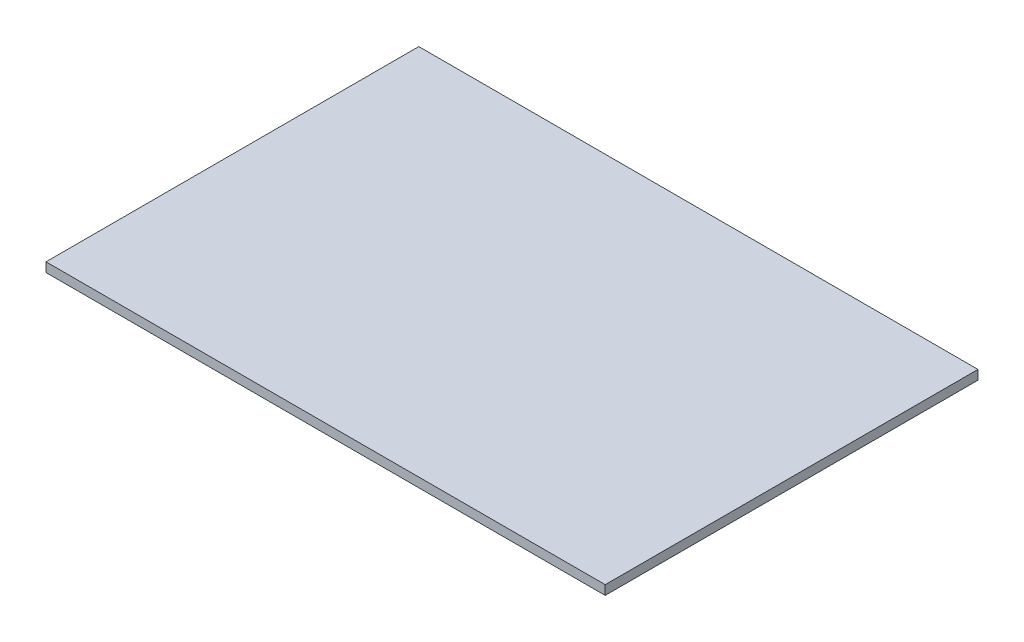
ISO-10303-21;
HEADER;
FILE_DESCRIPTION(('STEP AP214'),'2;1');
FILE_NAME('part.step','',(''),(''),'','','');
FILE_SCHEMA(('AUTOMOTIVE_DESIGN { 1 0 10303 214 1 1 1 1 }'));
ENDSEC;
DATA;
#1=APPLICATION_CONTEXT('core data for automotive mechanical design processes');
#2=APPLICATION_PROTOCOL_DEFINITION('international standard','automotive_design',2000,#1);
#3=PRODUCT_CONTEXT('',#1,'mechanical');
#4=PRODUCT('Part','Part','',(#3));
#5=PRODUCT_RELATED_PRODUCT_CATEGORY('part','',(#4));
#6=PRODUCT_DEFINITION_FORMATION('','',#4);
#7=PRODUCT_DEFINITION_CONTEXT('part definition',#1,'design');
#8=PRODUCT_DEFINITION('design','',#6,#7);
#9=PRODUCT_DEFINITION_SHAPE('','',#8);
#10=(LENGTH_UNIT() NAMED_UNIT(*) SI_UNIT(.MILLI.,.METRE.));
#11=(NAMED_UNIT(*) PLANE_ANGLE_UNIT() SI_UNIT($,.RADIAN.));
#12=(NAMED_UNIT(*) SI_UNIT($,.STERADIAN.) SOLID_ANGLE_UNIT());
#13=UNCERTAINTY_MEASURE_WITH_UNIT(LENGTH_MEASURE(1.E-05),#10,'distance_accuracy_value','');
#14=(GEOMETRIC_REPRESENTATION_CONTEXT(3) GLOBAL_UNCERTAINTY_ASSIGNED_CONTEXT((#13)) GLOBAL_UNIT_ASSIGNED_CONTEXT((#10,
#11,#12)) REPRESENTATION_CONTEXT('',''));
#15=CARTESIAN_POINT('',(0.,0.,0.));
#16=DIRECTION('',(0.,0.,1.));
#17=DIRECTION('',(1.,0.,0.));
#18=AXIS2_PLACEMENT_3D('',#15,#16,#17);
#19=CARTESIAN_POINT('',(-1500.,50.,-1000.));
#20=DIRECTION('',(1.,0.,0.));
#21=DIRECTION('',(0.,0.,-1.));
#22=AXIS2_PLACEMENT_3D('',#19,#20,#21);
#23=PLANE('',#22);
#24=DIRECTION('',(0.,0.,1.));
#25=VECTOR('',#24,1.);
#26=CARTESIAN_POINT('',(-1500.,0.,-1000.));
#27=LINE('',#26,#25);
#28=CARTESIAN_POINT('',(-1500.,0.,-1000.));
#29=VERTEX_POINT('',#28);
#30=CARTESIAN_POINT('',(-1500.,0.,1000.));
#31=VERTEX_POINT('',#30);
#32=EDGE_CURVE('E95',#29,#31,#27,.T.);
#33=ORIENTED_EDGE('',*,*,#32,.T.);
#34=DIRECTION('',(0.,-1.,0.));
#35=VECTOR('',#34,1.);
#36=CARTESIAN_POINT('',(-1500.,50.,1000.));
#37=LINE('',#36,#35);
#38=CARTESIAN_POINT('',(-1500.,50.,1000.));
#39=VERTEX_POINT('',#38);
#40=EDGE_CURVE('E11',#39,#31,#37,.T.);
#41=ORIENTED_EDGE('',*,*,#40,.F.);
#42=DIRECTION('',(0.,0.,1.));
#43=VECTOR('',#42,1.);
#44=CARTESIAN_POINT('',(-1500.,50.,-1000.));
#45=LINE('',#44,#43);
#46=CARTESIAN_POINT('',(-1500.,50.,-1000.));
#47=VERTEX_POINT('',#46);
#48=EDGE_CURVE('E83',#47,#39,#45,.T.);
#49=ORIENTED_EDGE('',*,*,#48,.F.);
#50=DIRECTION('',(0.,-1.,0.));
#51=VECTOR('',#50,1.);
#52=CARTESIAN_POINT('',(-1500.,50.,-1000.));
#53=LINE('',#52,#51);
#54=EDGE_CURVE('E91',#47,#29,#53,.T.);
#55=ORIENTED_EDGE('',*,*,#54,.T.);
#56=EDGE_LOOP('',(#33,#41,#49,#55));
#57=FACE_BOUND('',#56,.T.);
#58=ADVANCED_FACE('F32',(#57),#23,.F.);
#59=CARTESIAN_POINT('',(-1500.,50.,1000.));
#60=DIRECTION('',(0.,0.,-1.));
#61=DIRECTION('',(-1.,0.,0.));
#62=AXIS2_PLACEMENT_3D('',#59,#60,#61);
#63=PLANE('',#62);
#64=DIRECTION('',(1.,0.,0.));
#65=VECTOR('',#64,1.);
#66=CARTESIAN_POINT('',(-1500.,0.,1000.));
#67=LINE('',#66,#65);
#68=CARTESIAN_POINT('',(1500.,0.,1000.));
#69=VERTEX_POINT('',#68);
#70=EDGE_CURVE('E87',#31,#69,#67,.T.);
#71=ORIENTED_EDGE('',*,*,#70,.T.);
#72=DIRECTION('',(0.,-1.,0.));
#73=VECTOR('',#72,1.);
#74=CARTESIAN_POINT('',(1500.,50.,1000.));
#75=LINE('',#74,#73);
#76=CARTESIAN_POINT('',(1500.,50.,1000.));
#77=VERTEX_POINT('',#76);
#78=EDGE_CURVE('E40',#77,#69,#75,.T.);
#79=ORIENTED_EDGE('',*,*,#78,.F.);
#80=DIRECTION('',(1.,0.,0.));
#81=VECTOR('',#80,1.);
#82=CARTESIAN_POINT('',(-1500.,50.,1000.));
#83=LINE('',#82,#81);
#84=EDGE_CURVE('E78',#39,#77,#83,.T.);
#85=ORIENTED_EDGE('',*,*,#84,.F.);
#86=ORIENTED_EDGE('',*,*,#40,.T.);
#87=EDGE_LOOP('',(#71,#79,#85,#86));
#88=FACE_BOUND('',#87,.T.);
#89=ADVANCED_FACE('F86',(#88),#63,.F.);
#90=CARTESIAN_POINT('',(1500.,50.,-1000.));
#91=DIRECTION('',(-1.,0.,0.));
#92=DIRECTION('',(0.,0.,1.));
#93=AXIS2_PLACEMENT_3D('',#90,#91,#92);
#94=PLANE('',#93);
#95=DIRECTION('',(0.,0.,-1.));
#96=VECTOR('',#95,1.);
#97=CARTESIAN_POINT('',(1500.,0.,-1000.));
#98=LINE('',#97,#96);
#99=CARTESIAN_POINT('',(1500.,0.,-1000.));
#100=VERTEX_POINT('',#99);
#101=EDGE_CURVE('E65',#69,#100,#98,.T.);
#102=ORIENTED_EDGE('',*,*,#101,.T.);
#103=DIRECTION('',(0.,-1.,0.));
#104=VECTOR('',#103,1.);
#105=CARTESIAN_POINT('',(1500.,50.,-1000.));
#106=LINE('',#105,#104);
#107=CARTESIAN_POINT('',(1500.,50.,-1000.));
#108=VERTEX_POINT('',#107);
#109=EDGE_CURVE('E88',#108,#100,#106,.T.);
#110=ORIENTED_EDGE('',*,*,#109,.F.);
#111=DIRECTION('',(0.,0.,-1.));
#112=VECTOR('',#111,1.);
#113=CARTESIAN_POINT('',(1500.,50.,-1000.));
#114=LINE('',#113,#112);
#115=EDGE_CURVE('E81',#77,#108,#114,.T.);
#116=ORIENTED_EDGE('',*,*,#115,.F.);
#117=ORIENTED_EDGE('',*,*,#78,.T.);
#118=EDGE_LOOP('',(#102,#110,#116,#117));
#119=FACE_BOUND('',#118,.T.);
#120=ADVANCED_FACE('F89',(#119),#94,.F.);
#121=CARTESIAN_POINT('',(-1500.,50.,-1000.));
#122=DIRECTION('',(0.,0.,1.));
#123=DIRECTION('',(1.,0.,0.));
#124=AXIS2_PLACEMENT_3D('',#121,#122,#123);
#125=PLANE('',#124);
#126=DIRECTION('',(-1.,0.,0.));
#127=VECTOR('',#126,1.);
#128=CARTESIAN_POINT('',(-1500.,0.,-1000.));
#129=LINE('',#128,#127);
#130=EDGE_CURVE('E71',#100,#29,#129,.T.);
#131=ORIENTED_EDGE('',*,*,#130,.T.);
#132=ORIENTED_EDGE('',*,*,#54,.F.);
#133=DIRECTION('',(-1.,0.,0.));
#134=VECTOR('',#133,1.);
#135=CARTESIAN_POINT('',(-1500.,50.,-1000.));
#136=LINE('',#135,#134);
#137=EDGE_CURVE('E48',#108,#47,#136,.T.);
#138=ORIENTED_EDGE('',*,*,#137,.F.);
#139=ORIENTED_EDGE('',*,*,#109,.T.);
#140=EDGE_LOOP('',(#131,#132,#138,#139));
#141=FACE_BOUND('',#140,.T.);
#142=ADVANCED_FACE('F102',(#141),#125,.F.);
#143=CARTESIAN_POINT('',(-1500.,50.,1000.));
#144=DIRECTION('',(0.,1.,0.));
#145=DIRECTION('',(0.,0.,1.));
#146=AXIS2_PLACEMENT_3D('',#143,#144,#145);
#147=PLANE('',#146);
#148=ORIENTED_EDGE('',*,*,#48,.T.);
#149=ORIENTED_EDGE('',*,*,#84,.T.);
#150=ORIENTED_EDGE('',*,*,#115,.T.);
#151=ORIENTED_EDGE('',*,*,#137,.T.);
#152=EDGE_LOOP('',(#148,#149,#150,#151));
#153=FACE_BOUND('',#152,.T.);
#154=ADVANCED_FACE('F79',(#153),#147,.T.);
#155=CARTESIAN_POINT('',(-1500.,0.,1000.));
#156=DIRECTION('',(0.,1.,0.));
#157=DIRECTION('',(0.,0.,1.));
#158=AXIS2_PLACEMENT_3D('',#155,#156,#157);
#159=PLANE('',#158);
#160=ORIENTED_EDGE('',*,*,#32,.F.);
#161=ORIENTED_EDGE('',*,*,#130,.F.);
#162=ORIENTED_EDGE('',*,*,#101,.F.);
#163=ORIENTED_EDGE('',*,*,#70,.F.);
#164=EDGE_LOOP('',(#160,#161,#162,#163));
#165=FACE_BOUND('',#164,.T.);
#166=ADVANCED_FACE('F105',(#165),#159,.F.);
#167=CLOSED_SHELL('',(#58,#89,#120,#142,#154,#166));
#168=MANIFOLD_SOLID_BREP('B2',#167);
#169=ADVANCED_BREP_SHAPE_REPRESENTATION('',(#18,#168),#14);
#170=SHAPE_DEFINITION_REPRESENTATION(#9,#169);
ENDSEC;
END-ISO-10303-21;
